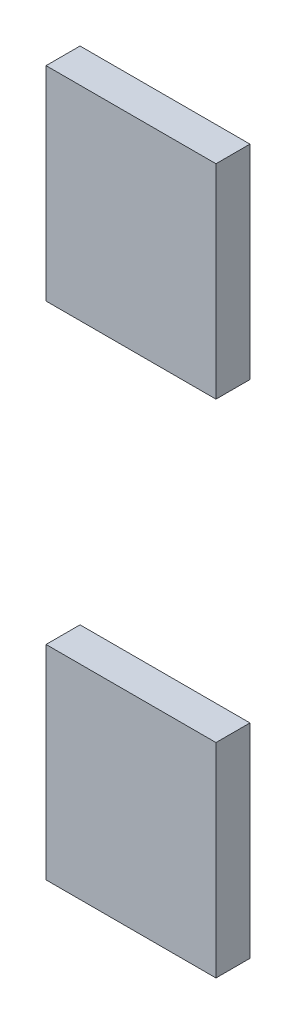
ISO-10303-21;
HEADER;
FILE_DESCRIPTION(('STEP AP214'),'2;1');
FILE_NAME('part.step','',(''),(''),'','','');
FILE_SCHEMA(('AUTOMOTIVE_DESIGN { 1 0 10303 214 1 1 1 1 }'));
ENDSEC;
DATA;
#1=APPLICATION_CONTEXT('core data for automotive mechanical design processes');
#2=APPLICATION_PROTOCOL_DEFINITION('international standard','automotive_design',2000,#1);
#3=PRODUCT_CONTEXT('',#1,'mechanical');
#4=PRODUCT('Part','Part','',(#3));
#5=PRODUCT_RELATED_PRODUCT_CATEGORY('part','',(#4));
#6=PRODUCT_DEFINITION_FORMATION('','',#4);
#7=PRODUCT_DEFINITION_CONTEXT('part definition',#1,'design');
#8=PRODUCT_DEFINITION('design','',#6,#7);
#9=PRODUCT_DEFINITION_SHAPE('','',#8);
#10=(LENGTH_UNIT() NAMED_UNIT(*) SI_UNIT(.MILLI.,.METRE.));
#11=(NAMED_UNIT(*) PLANE_ANGLE_UNIT() SI_UNIT($,.RADIAN.));
#12=(NAMED_UNIT(*) SI_UNIT($,.STERADIAN.) SOLID_ANGLE_UNIT());
#13=UNCERTAINTY_MEASURE_WITH_UNIT(LENGTH_MEASURE(1.E-05),#10,'distance_accuracy_value','');
#14=(GEOMETRIC_REPRESENTATION_CONTEXT(3) GLOBAL_UNCERTAINTY_ASSIGNED_CONTEXT((#13)) GLOBAL_UNIT_ASSIGNED_CONTEXT((#10,
#11,#12)) REPRESENTATION_CONTEXT('',''));
#15=CARTESIAN_POINT('',(0.,0.,0.));
#16=DIRECTION('',(0.,0.,1.));
#17=DIRECTION('',(1.,0.,0.));
#18=AXIS2_PLACEMENT_3D('',#15,#16,#17);
#19=CARTESIAN_POINT('',(-9.5,-4.375,1.));
#20=DIRECTION('',(1.,0.,0.));
#21=DIRECTION('',(0.,0.,-1.));
#22=AXIS2_PLACEMENT_3D('',#19,#20,#21);
#23=PLANE('',#22);
#24=DIRECTION('',(0.,-1.,0.));
#25=VECTOR('',#24,1.);
#26=CARTESIAN_POINT('',(-9.5,-4.375,0.));
#27=LINE('',#26,#25);
#28=CARTESIAN_POINT('',(-9.5,-4.375,0.));
#29=VERTEX_POINT('',#28);
#30=CARTESIAN_POINT('',(-9.5,-10.375,0.));
#31=VERTEX_POINT('',#30);
#32=EDGE_CURVE('E12',#29,#31,#27,.T.);
#33=ORIENTED_EDGE('',*,*,#32,.T.);
#34=DIRECTION('',(0.,0.,-1.));
#35=VECTOR('',#34,1.);
#36=CARTESIAN_POINT('',(-9.5,-10.375,1.));
#37=LINE('',#36,#35);
#38=CARTESIAN_POINT('',(-9.5,-10.375,1.));
#39=VERTEX_POINT('',#38);
#40=EDGE_CURVE('E120',#39,#31,#37,.T.);
#41=ORIENTED_EDGE('',*,*,#40,.F.);
#42=DIRECTION('',(0.,-1.,0.));
#43=VECTOR('',#42,1.);
#44=CARTESIAN_POINT('',(-9.5,-4.375,1.));
#45=LINE('',#44,#43);
#46=CARTESIAN_POINT('',(-9.5,-4.375,1.));
#47=VERTEX_POINT('',#46);
#48=EDGE_CURVE('E53',#47,#39,#45,.T.);
#49=ORIENTED_EDGE('',*,*,#48,.F.);
#50=DIRECTION('',(0.,0.,-1.));
#51=VECTOR('',#50,1.);
#52=CARTESIAN_POINT('',(-9.5,-4.375,1.));
#53=LINE('',#52,#51);
#54=EDGE_CURVE('E108',#47,#29,#53,.T.);
#55=ORIENTED_EDGE('',*,*,#54,.T.);
#56=EDGE_LOOP('',(#33,#41,#49,#55));
#57=FACE_BOUND('',#56,.T.);
#58=ADVANCED_FACE('F49',(#57),#23,.F.);
#59=CARTESIAN_POINT('',(-9.5,-10.375,1.));
#60=DIRECTION('',(0.,1.,0.));
#61=DIRECTION('',(0.,0.,1.));
#62=AXIS2_PLACEMENT_3D('',#59,#60,#61);
#63=PLANE('',#62);
#64=DIRECTION('',(1.,0.,0.));
#65=VECTOR('',#64,1.);
#66=CARTESIAN_POINT('',(-9.5,-10.375,0.));
#67=LINE('',#66,#65);
#68=CARTESIAN_POINT('',(-4.5,-10.375,0.));
#69=VERTEX_POINT('',#68);
#70=EDGE_CURVE('E59',#31,#69,#67,.T.);
#71=ORIENTED_EDGE('',*,*,#70,.T.);
#72=DIRECTION('',(0.,0.,-1.));
#73=VECTOR('',#72,1.);
#74=CARTESIAN_POINT('',(-4.5,-10.375,1.));
#75=LINE('',#74,#73);
#76=CARTESIAN_POINT('',(-4.5,-10.375,1.));
#77=VERTEX_POINT('',#76);
#78=EDGE_CURVE('E104',#77,#69,#75,.T.);
#79=ORIENTED_EDGE('',*,*,#78,.F.);
#80=DIRECTION('',(1.,0.,0.));
#81=VECTOR('',#80,1.);
#82=CARTESIAN_POINT('',(-9.5,-10.375,1.));
#83=LINE('',#82,#81);
#84=EDGE_CURVE('E83',#39,#77,#83,.T.);
#85=ORIENTED_EDGE('',*,*,#84,.F.);
#86=ORIENTED_EDGE('',*,*,#40,.T.);
#87=EDGE_LOOP('',(#71,#79,#85,#86));
#88=FACE_BOUND('',#87,.T.);
#89=ADVANCED_FACE('F123',(#88),#63,.F.);
#90=CARTESIAN_POINT('',(-4.5,-4.375,1.));
#91=DIRECTION('',(-1.,0.,0.));
#92=DIRECTION('',(0.,-1.,0.));
#93=AXIS2_PLACEMENT_3D('',#90,#91,#92);
#94=PLANE('',#93);
#95=DIRECTION('',(0.,1.,0.));
#96=VECTOR('',#95,1.);
#97=CARTESIAN_POINT('',(-4.5,-4.375,0.));
#98=LINE('',#97,#96);
#99=CARTESIAN_POINT('',(-4.5,-4.375,0.));
#100=VERTEX_POINT('',#99);
#101=EDGE_CURVE('E99',#69,#100,#98,.T.);
#102=ORIENTED_EDGE('',*,*,#101,.T.);
#103=DIRECTION('',(0.,0.,-1.));
#104=VECTOR('',#103,1.);
#105=CARTESIAN_POINT('',(-4.5,-4.375,1.));
#106=LINE('',#105,#104);
#107=CARTESIAN_POINT('',(-4.5,-4.375,1.));
#108=VERTEX_POINT('',#107);
#109=EDGE_CURVE('E102',#108,#100,#106,.T.);
#110=ORIENTED_EDGE('',*,*,#109,.F.);
#111=DIRECTION('',(0.,1.,0.));
#112=VECTOR('',#111,1.);
#113=CARTESIAN_POINT('',(-4.5,-4.375,1.));
#114=LINE('',#113,#112);
#115=EDGE_CURVE('E116',#77,#108,#114,.T.);
#116=ORIENTED_EDGE('',*,*,#115,.F.);
#117=ORIENTED_EDGE('',*,*,#78,.T.);
#118=EDGE_LOOP('',(#102,#110,#116,#117));
#119=FACE_BOUND('',#118,.T.);
#120=ADVANCED_FACE('F100',(#119),#94,.F.);
#121=CARTESIAN_POINT('',(-9.5,-4.375,1.));
#122=DIRECTION('',(0.,-1.,0.));
#123=DIRECTION('',(0.,0.,-1.));
#124=AXIS2_PLACEMENT_3D('',#121,#122,#123);
#125=PLANE('',#124);
#126=DIRECTION('',(-1.,0.,0.));
#127=VECTOR('',#126,1.);
#128=CARTESIAN_POINT('',(-9.5,-4.375,0.));
#129=LINE('',#128,#127);
#130=EDGE_CURVE('E93',#100,#29,#129,.T.);
#131=ORIENTED_EDGE('',*,*,#130,.T.);
#132=ORIENTED_EDGE('',*,*,#54,.F.);
#133=DIRECTION('',(-1.,0.,0.));
#134=VECTOR('',#133,1.);
#135=CARTESIAN_POINT('',(-9.5,-4.375,1.));
#136=LINE('',#135,#134);
#137=EDGE_CURVE('E107',#108,#47,#136,.T.);
#138=ORIENTED_EDGE('',*,*,#137,.F.);
#139=ORIENTED_EDGE('',*,*,#109,.T.);
#140=EDGE_LOOP('',(#131,#132,#138,#139));
#141=FACE_BOUND('',#140,.T.);
#142=ADVANCED_FACE('F106',(#141),#125,.F.);
#143=CARTESIAN_POINT('',(0.,0.,1.));
#144=DIRECTION('',(0.,0.,1.));
#145=DIRECTION('',(1.,0.,0.));
#146=AXIS2_PLACEMENT_3D('',#143,#144,#145);
#147=PLANE('',#146);
#148=ORIENTED_EDGE('',*,*,#48,.T.);
#149=ORIENTED_EDGE('',*,*,#84,.T.);
#150=ORIENTED_EDGE('',*,*,#115,.T.);
#151=ORIENTED_EDGE('',*,*,#137,.T.);
#152=EDGE_LOOP('',(#148,#149,#150,#151));
#153=FACE_BOUND('',#152,.T.);
#154=ADVANCED_FACE('F51',(#153),#147,.T.);
#155=CARTESIAN_POINT('',(0.,0.,0.));
#156=DIRECTION('',(0.,0.,1.));
#157=DIRECTION('',(1.,0.,0.));
#158=AXIS2_PLACEMENT_3D('',#155,#156,#157);
#159=PLANE('',#158);
#160=ORIENTED_EDGE('',*,*,#32,.F.);
#161=ORIENTED_EDGE('',*,*,#130,.F.);
#162=ORIENTED_EDGE('',*,*,#101,.F.);
#163=ORIENTED_EDGE('',*,*,#70,.F.);
#164=EDGE_LOOP('',(#160,#161,#162,#163));
#165=FACE_BOUND('',#164,.T.);
#166=ADVANCED_FACE('F110',(#165),#159,.F.);
#167=CLOSED_SHELL('',(#58,#89,#120,#142,#154,#166));
#168=MANIFOLD_SOLID_BREP('B2',#167);
#169=CARTESIAN_POINT('',(-9.5,4.375,1.));
#170=DIRECTION('',(1.,0.,0.));
#171=DIRECTION('',(0.,0.,-1.));
#172=AXIS2_PLACEMENT_3D('',#169,#170,#171);
#173=PLANE('',#172);
#174=DIRECTION('',(0.,-1.,0.));
#175=VECTOR('',#174,1.);
#176=CARTESIAN_POINT('',(-9.5,4.375,0.));
#177=LINE('',#176,#175);
#178=CARTESIAN_POINT('',(-9.5,10.375,0.));
#179=VERTEX_POINT('',#178);
#180=CARTESIAN_POINT('',(-9.5,4.375,0.));
#181=VERTEX_POINT('',#180);
#182=EDGE_CURVE('E236',#179,#181,#177,.T.);
#183=ORIENTED_EDGE('',*,*,#182,.T.);
#184=DIRECTION('',(0.,0.,-1.));
#185=VECTOR('',#184,1.);
#186=CARTESIAN_POINT('',(-9.5,4.375,1.));
#187=LINE('',#186,#185);
#188=CARTESIAN_POINT('',(-9.5,4.375,1.));
#189=VERTEX_POINT('',#188);
#190=EDGE_CURVE('E47',#189,#181,#187,.T.);
#191=ORIENTED_EDGE('',*,*,#190,.F.);
#192=DIRECTION('',(0.,-1.,0.));
#193=VECTOR('',#192,1.);
#194=CARTESIAN_POINT('',(-9.5,4.375,1.));
#195=LINE('',#194,#193);
#196=CARTESIAN_POINT('',(-9.5,10.375,1.));
#197=VERTEX_POINT('',#196);
#198=EDGE_CURVE('E224',#197,#189,#195,.T.);
#199=ORIENTED_EDGE('',*,*,#198,.F.);
#200=DIRECTION('',(0.,0.,-1.));
#201=VECTOR('',#200,1.);
#202=CARTESIAN_POINT('',(-9.5,10.375,1.));
#203=LINE('',#202,#201);
#204=EDGE_CURVE('E232',#197,#179,#203,.T.);
#205=ORIENTED_EDGE('',*,*,#204,.T.);
#206=EDGE_LOOP('',(#183,#191,#199,#205));
#207=FACE_BOUND('',#206,.T.);
#208=ADVANCED_FACE('F173',(#207),#173,.F.);
#209=CARTESIAN_POINT('',(-9.5,4.375,1.));
#210=DIRECTION('',(0.,1.,0.));
#211=DIRECTION('',(0.,0.,1.));
#212=AXIS2_PLACEMENT_3D('',#209,#210,#211);
#213=PLANE('',#212);
#214=DIRECTION('',(1.,0.,0.));
#215=VECTOR('',#214,1.);
#216=CARTESIAN_POINT('',(-9.5,4.375,0.));
#217=LINE('',#216,#215);
#218=CARTESIAN_POINT('',(-4.5,4.375,0.));
#219=VERTEX_POINT('',#218);
#220=EDGE_CURVE('E228',#181,#219,#217,.T.);
#221=ORIENTED_EDGE('',*,*,#220,.T.);
#222=DIRECTION('',(0.,0.,-1.));
#223=VECTOR('',#222,1.);
#224=CARTESIAN_POINT('',(-4.5,4.375,1.));
#225=LINE('',#224,#223);
#226=CARTESIAN_POINT('',(-4.5,4.375,1.));
#227=VERTEX_POINT('',#226);
#228=EDGE_CURVE('E181',#227,#219,#225,.T.);
#229=ORIENTED_EDGE('',*,*,#228,.F.);
#230=DIRECTION('',(1.,0.,0.));
#231=VECTOR('',#230,1.);
#232=CARTESIAN_POINT('',(-9.5,4.375,1.));
#233=LINE('',#232,#231);
#234=EDGE_CURVE('E219',#189,#227,#233,.T.);
#235=ORIENTED_EDGE('',*,*,#234,.F.);
#236=ORIENTED_EDGE('',*,*,#190,.T.);
#237=EDGE_LOOP('',(#221,#229,#235,#236));
#238=FACE_BOUND('',#237,.T.);
#239=ADVANCED_FACE('F227',(#238),#213,.F.);
#240=CARTESIAN_POINT('',(-4.5,4.375,1.));
#241=DIRECTION('',(-1.,0.,0.));
#242=DIRECTION('',(0.,-1.,0.));
#243=AXIS2_PLACEMENT_3D('',#240,#241,#242);
#244=PLANE('',#243);
#245=DIRECTION('',(0.,1.,0.));
#246=VECTOR('',#245,1.);
#247=CARTESIAN_POINT('',(-4.5,4.375,0.));
#248=LINE('',#247,#246);
#249=CARTESIAN_POINT('',(-4.5,10.375,0.));
#250=VERTEX_POINT('',#249);
#251=EDGE_CURVE('E206',#219,#250,#248,.T.);
#252=ORIENTED_EDGE('',*,*,#251,.T.);
#253=DIRECTION('',(0.,0.,-1.));
#254=VECTOR('',#253,1.);
#255=CARTESIAN_POINT('',(-4.5,10.375,1.));
#256=LINE('',#255,#254);
#257=CARTESIAN_POINT('',(-4.5,10.375,1.));
#258=VERTEX_POINT('',#257);
#259=EDGE_CURVE('E229',#258,#250,#256,.T.);
#260=ORIENTED_EDGE('',*,*,#259,.F.);
#261=DIRECTION('',(0.,1.,0.));
#262=VECTOR('',#261,1.);
#263=CARTESIAN_POINT('',(-4.5,4.375,1.));
#264=LINE('',#263,#262);
#265=EDGE_CURVE('E222',#227,#258,#264,.T.);
#266=ORIENTED_EDGE('',*,*,#265,.F.);
#267=ORIENTED_EDGE('',*,*,#228,.T.);
#268=EDGE_LOOP('',(#252,#260,#266,#267));
#269=FACE_BOUND('',#268,.T.);
#270=ADVANCED_FACE('F230',(#269),#244,.F.);
#271=CARTESIAN_POINT('',(-9.5,10.375,1.));
#272=DIRECTION('',(0.,-1.,0.));
#273=DIRECTION('',(0.,0.,-1.));
#274=AXIS2_PLACEMENT_3D('',#271,#272,#273);
#275=PLANE('',#274);
#276=DIRECTION('',(-1.,0.,0.));
#277=VECTOR('',#276,1.);
#278=CARTESIAN_POINT('',(-9.5,10.375,0.));
#279=LINE('',#278,#277);
#280=EDGE_CURVE('E212',#250,#179,#279,.T.);
#281=ORIENTED_EDGE('',*,*,#280,.T.);
#282=ORIENTED_EDGE('',*,*,#204,.F.);
#283=DIRECTION('',(-1.,0.,0.));
#284=VECTOR('',#283,1.);
#285=CARTESIAN_POINT('',(-9.5,10.375,1.));
#286=LINE('',#285,#284);
#287=EDGE_CURVE('E189',#258,#197,#286,.T.);
#288=ORIENTED_EDGE('',*,*,#287,.F.);
#289=ORIENTED_EDGE('',*,*,#259,.T.);
#290=EDGE_LOOP('',(#281,#282,#288,#289));
#291=FACE_BOUND('',#290,.T.);
#292=ADVANCED_FACE('F243',(#291),#275,.F.);
#293=CARTESIAN_POINT('',(0.,0.,1.));
#294=DIRECTION('',(0.,0.,-1.));
#295=DIRECTION('',(-1.,0.,0.));
#296=AXIS2_PLACEMENT_3D('',#293,#294,#295);
#297=PLANE('',#296);
#298=ORIENTED_EDGE('',*,*,#198,.T.);
#299=ORIENTED_EDGE('',*,*,#234,.T.);
#300=ORIENTED_EDGE('',*,*,#265,.T.);
#301=ORIENTED_EDGE('',*,*,#287,.T.);
#302=EDGE_LOOP('',(#298,#299,#300,#301));
#303=FACE_BOUND('',#302,.T.);
#304=ADVANCED_FACE('F220',(#303),#297,.F.);
#305=CARTESIAN_POINT('',(0.,0.,0.));
#306=DIRECTION('',(0.,0.,-1.));
#307=DIRECTION('',(-1.,0.,0.));
#308=AXIS2_PLACEMENT_3D('',#305,#306,#307);
#309=PLANE('',#308);
#310=ORIENTED_EDGE('',*,*,#182,.F.);
#311=ORIENTED_EDGE('',*,*,#280,.F.);
#312=ORIENTED_EDGE('',*,*,#251,.F.);
#313=ORIENTED_EDGE('',*,*,#220,.F.);
#314=EDGE_LOOP('',(#310,#311,#312,#313));
#315=FACE_BOUND('',#314,.T.);
#316=ADVANCED_FACE('F246',(#315),#309,.T.);
#317=CLOSED_SHELL('',(#208,#239,#270,#292,#304,#316));
#318=MANIFOLD_SOLID_BREP('B6',#317);
#319=ADVANCED_BREP_SHAPE_REPRESENTATION('',(#18,#168,#318),#14);
#320=SHAPE_DEFINITION_REPRESENTATION(#9,#319);
ENDSEC;
END-ISO-10303-21;
